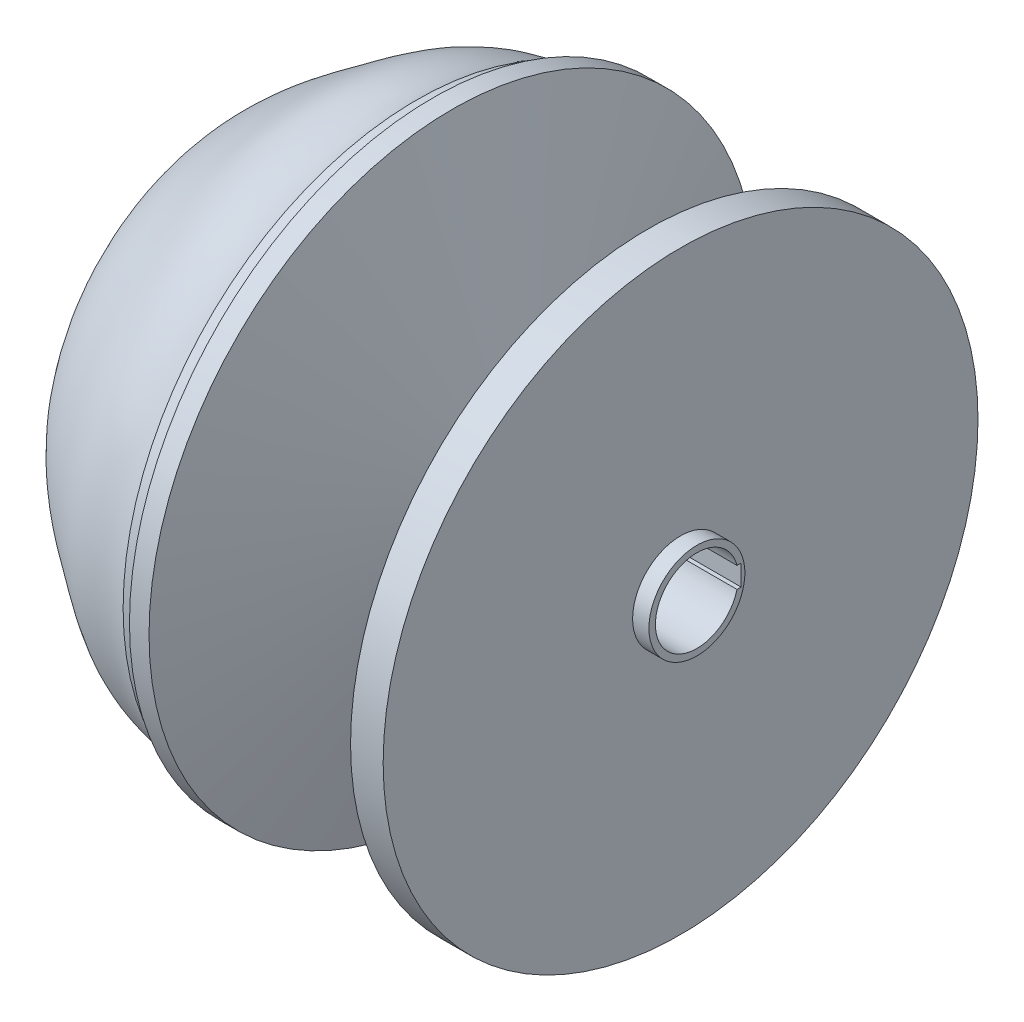
ISO-10303-21;
HEADER;
FILE_DESCRIPTION(('STEP AP214'),'2;1');
FILE_NAME('part.step','',(''),(''),'','','');
FILE_SCHEMA(('AUTOMOTIVE_DESIGN { 1 0 10303 214 1 1 1 1 }'));
ENDSEC;
DATA;
#1=APPLICATION_CONTEXT('core data for automotive mechanical design processes');
#2=APPLICATION_PROTOCOL_DEFINITION('international standard','automotive_design',2000,#1);
#3=PRODUCT_CONTEXT('',#1,'mechanical');
#4=PRODUCT('Part','Part','',(#3));
#5=PRODUCT_RELATED_PRODUCT_CATEGORY('part','',(#4));
#6=PRODUCT_DEFINITION_FORMATION('','',#4);
#7=PRODUCT_DEFINITION_CONTEXT('part definition',#1,'design');
#8=PRODUCT_DEFINITION('design','',#6,#7);
#9=PRODUCT_DEFINITION_SHAPE('','',#8);
#10=(LENGTH_UNIT() NAMED_UNIT(*) SI_UNIT(.MILLI.,.METRE.));
#11=(NAMED_UNIT(*) PLANE_ANGLE_UNIT() SI_UNIT($,.RADIAN.));
#12=(NAMED_UNIT(*) SI_UNIT($,.STERADIAN.) SOLID_ANGLE_UNIT());
#13=UNCERTAINTY_MEASURE_WITH_UNIT(LENGTH_MEASURE(1.E-05),#10,'distance_accuracy_value','');
#14=(GEOMETRIC_REPRESENTATION_CONTEXT(3) GLOBAL_UNCERTAINTY_ASSIGNED_CONTEXT((#13)) GLOBAL_UNIT_ASSIGNED_CONTEXT((#10,
#11,#12)) REPRESENTATION_CONTEXT('',''));
#15=CARTESIAN_POINT('',(0.,0.,0.));
#16=DIRECTION('',(0.,0.,1.));
#17=DIRECTION('',(1.,0.,0.));
#18=AXIS2_PLACEMENT_3D('',#15,#16,#17);
#19=CARTESIAN_POINT('',(79.335001792058,14.7092942906539,0.));
#20=DIRECTION('',(-1.,0.,0.));
#21=DIRECTION('',(0.,0.,1.));
#22=AXIS2_PLACEMENT_3D('',#19,#20,#21);
#23=PLANE('',#22);
#24=DIRECTION('',(0.,1.,0.));
#25=VECTOR('',#24,1.);
#26=CARTESIAN_POINT('',(79.335001792058,3.1875,-13.5635));
#27=LINE('',#26,#25);
#28=CARTESIAN_POINT('',(79.335001792058,-3.1875,-13.5635));
#29=VERTEX_POINT('',#28);
#30=CARTESIAN_POINT('',(79.335001792058,3.1875,-13.5635));
#31=VERTEX_POINT('',#30);
#32=EDGE_CURVE('E85',#29,#31,#27,.T.);
#33=ORIENTED_EDGE('',*,*,#32,.F.);
#34=DIRECTION('',(0.,0.,-1.));
#35=VECTOR('',#34,1.);
#36=CARTESIAN_POINT('',(79.335001792058,-3.1875,-11.8725));
#37=LINE('',#36,#35);
#38=CARTESIAN_POINT('',(79.335001792058,-3.1875,-12.3120821858043));
#39=VERTEX_POINT('',#38);
#40=EDGE_CURVE('E96',#39,#29,#37,.T.);
#41=ORIENTED_EDGE('',*,*,#40,.F.);
#42=CARTESIAN_POINT('',(79.335001792058,0.,0.));
#43=DIRECTION('',(1.,0.,0.));
#44=DIRECTION('',(0.,0.,-1.));
#45=AXIS2_PLACEMENT_3D('',#42,#43,#44);
#46=CIRCLE('',#45,12.718);
#47=CARTESIAN_POINT('',(79.335001792058,3.1875,-12.3120821858043));
#48=VERTEX_POINT('',#47);
#49=EDGE_CURVE('E108',#48,#39,#46,.T.);
#50=ORIENTED_EDGE('',*,*,#49,.F.);
#51=DIRECTION('',(0.,0.,1.));
#52=VECTOR('',#51,1.);
#53=CARTESIAN_POINT('',(79.335001792058,3.1875,-11.8725));
#54=LINE('',#53,#52);
#55=EDGE_CURVE('E98',#31,#48,#54,.T.);
#56=ORIENTED_EDGE('',*,*,#55,.F.);
#57=EDGE_LOOP('',(#33,#41,#50,#56));
#58=FACE_BOUND('',#57,.T.);
#59=CARTESIAN_POINT('',(79.335001792058,0.,0.));
#60=DIRECTION('',(-1.,0.,0.));
#61=DIRECTION('',(0.,0.,1.));
#62=AXIS2_PLACEMENT_3D('',#59,#60,#61);
#63=CIRCLE('',#62,14.7092942906539);
#64=CARTESIAN_POINT('',(79.335001792058,0.,14.7092942906539));
#65=VERTEX_POINT('',#64);
#66=EDGE_CURVE('E173',#65,#65,#63,.T.);
#67=ORIENTED_EDGE('',*,*,#66,.F.);
#68=EDGE_LOOP('',(#67));
#69=FACE_BOUND('',#68,.T.);
#70=ADVANCED_FACE('F39',(#58,#69),#23,.F.);
#71=CARTESIAN_POINT('',(-81.8356888062701,0.,0.));
#72=DIRECTION('',(-1.,0.,0.));
#73=DIRECTION('',(0.,0.,1.));
#74=AXIS2_PLACEMENT_3D('',#71,#72,#73);
#75=CYLINDRICAL_SURFACE('',#74,14.7092942906539);
#76=CARTESIAN_POINT('',(74.335001792058,0.,0.));
#77=DIRECTION('',(-1.,0.,0.));
#78=DIRECTION('',(0.,0.,1.));
#79=AXIS2_PLACEMENT_3D('',#76,#77,#78);
#80=CIRCLE('',#79,14.7092942906539);
#81=CARTESIAN_POINT('',(74.335001792058,0.,14.7092942906539));
#82=VERTEX_POINT('',#81);
#83=EDGE_CURVE('E176',#82,#82,#80,.T.);
#84=ORIENTED_EDGE('',*,*,#83,.F.);
#85=EDGE_LOOP('',(#84));
#86=FACE_BOUND('',#85,.T.);
#87=ORIENTED_EDGE('',*,*,#66,.T.);
#88=EDGE_LOOP('',(#87));
#89=FACE_BOUND('',#88,.T.);
#90=ADVANCED_FACE('F159',(#86,#89),#75,.T.);
#91=CARTESIAN_POINT('',(74.335001792058,91.2021540942188,0.));
#92=DIRECTION('',(-1.,0.,0.));
#93=DIRECTION('',(0.,0.,1.));
#94=AXIS2_PLACEMENT_3D('',#91,#92,#93);
#95=PLANE('',#94);
#96=CARTESIAN_POINT('',(74.3350017920579,0.,0.));
#97=DIRECTION('',(-1.,0.,0.));
#98=DIRECTION('',(0.,0.,1.));
#99=AXIS2_PLACEMENT_3D('',#96,#97,#98);
#100=CIRCLE('',#99,91.2021540942188);
#101=CARTESIAN_POINT('',(74.3350017920579,0.,91.2021540942188));
#102=VERTEX_POINT('',#101);
#103=EDGE_CURVE('E182',#102,#102,#100,.T.);
#104=ORIENTED_EDGE('',*,*,#103,.F.);
#105=EDGE_LOOP('',(#104));
#106=FACE_BOUND('',#105,.T.);
#107=ORIENTED_EDGE('',*,*,#83,.T.);
#108=EDGE_LOOP('',(#107));
#109=FACE_BOUND('',#108,.T.);
#110=ADVANCED_FACE('F155',(#106,#109),#95,.F.);
#111=CARTESIAN_POINT('',(-81.8356888062701,0.,0.));
#112=DIRECTION('',(-1.,0.,0.));
#113=DIRECTION('',(0.,0.,1.));
#114=AXIS2_PLACEMENT_3D('',#111,#112,#113);
#115=CYLINDRICAL_SURFACE('',#114,91.2021540942188);
#116=CARTESIAN_POINT('',(64.335001792058,0.,0.));
#117=DIRECTION('',(-1.,0.,0.));
#118=DIRECTION('',(0.,0.,1.));
#119=AXIS2_PLACEMENT_3D('',#116,#117,#118);
#120=CIRCLE('',#119,91.2021540942188);
#121=CARTESIAN_POINT('',(64.335001792058,0.,-91.2021540942188));
#122=VERTEX_POINT('',#121);
#123=EDGE_CURVE('E248',#122,#122,#120,.T.);
#124=ORIENTED_EDGE('',*,*,#123,.F.);
#125=EDGE_LOOP('',(#124));
#126=FACE_BOUND('',#125,.T.);
#127=ORIENTED_EDGE('',*,*,#103,.T.);
#128=EDGE_LOOP('',(#127));
#129=FACE_BOUND('',#128,.T.);
#130=ADVANCED_FACE('F151',(#126,#129),#115,.T.);
#131=CARTESIAN_POINT('',(64.335001792058,0.,0.));
#132=DIRECTION('',(1.,0.,0.));
#133=DIRECTION('',(0.,0.,-1.));
#134=AXIS2_PLACEMENT_3D('',#131,#132,#133);
#135=CONICAL_SURFACE('',#134,91.2021540942188,1.37003811702259);
#136=CARTESIAN_POINT('',(48.8278998094837,0.,0.));
#137=DIRECTION('',(-1.,0.,0.));
#138=DIRECTION('',(0.,0.,1.));
#139=AXIS2_PLACEMENT_3D('',#136,#137,#138);
#140=CIRCLE('',#139,15.);
#141=CARTESIAN_POINT('',(48.8278998094837,0.,-15.));
#142=VERTEX_POINT('',#141);
#143=EDGE_CURVE('E245',#142,#142,#140,.T.);
#144=CARTESIAN_POINT('',(48.8278998094837,0.,-15.));
#145=CARTESIAN_POINT('',(48.9894321218022,0.,-15.7937724384815));
#146=CARTESIAN_POINT('',(49.1509644341207,0.,-16.5875448769629));
#147=CARTESIAN_POINT('',(49.4740290587577,0.,-18.1750897539258));
#148=CARTESIAN_POINT('',(49.6355613710762,0.,-18.9688621924072));
#149=CARTESIAN_POINT('',(49.9586259957131,0.,-20.5564070693701));
#150=CARTESIAN_POINT('',(50.1201583080316,0.,-21.3501795078516));
#151=CARTESIAN_POINT('',(50.4432229326686,0.,-22.9377243848145));
#152=CARTESIAN_POINT('',(50.604755244987,0.,-23.7314968232959));
#153=CARTESIAN_POINT('',(50.927819869624,0.,-25.3190417002588));
#154=CARTESIAN_POINT('',(51.0893521819425,0.,-26.1128141387403));
#155=CARTESIAN_POINT('',(51.4124168065794,0.,-27.7003590157031));
#156=CARTESIAN_POINT('',(51.5739491188979,0.,-28.4941314541846));
#157=CARTESIAN_POINT('',(51.8970137435349,0.,-30.0816763311475));
#158=CARTESIAN_POINT('',(52.0585460558534,0.,-30.8754487696289));
#159=CARTESIAN_POINT('',(52.3816106804903,0.,-32.4629936465918));
#160=CARTESIAN_POINT('',(52.5431429928088,0.,-33.2567660850733));
#161=CARTESIAN_POINT('',(52.8662076174458,0.,-34.8443109620362));
#162=CARTESIAN_POINT('',(53.0277399297643,0.,-35.6380834005176));
#163=CARTESIAN_POINT('',(53.3508045544012,0.,-37.2256282774805));
#164=CARTESIAN_POINT('',(53.5123368667197,0.,-38.0194007159619));
#165=CARTESIAN_POINT('',(53.8354014913567,0.,-39.6069455929248));
#166=CARTESIAN_POINT('',(53.9969338036751,0.,-40.4007180314063));
#167=CARTESIAN_POINT('',(54.3199984283121,0.,-41.9882629083692));
#168=CARTESIAN_POINT('',(54.4815307406306,0.,-42.7820353468506));
#169=CARTESIAN_POINT('',(54.8045953652676,0.,-44.3695802238135));
#170=CARTESIAN_POINT('',(54.966127677586,0.,-45.163352662295));
#171=CARTESIAN_POINT('',(55.289192302223,0.,-46.7508975392578));
#172=CARTESIAN_POINT('',(55.4507246145415,0.,-47.5446699777393));
#173=CARTESIAN_POINT('',(55.7737892391784,0.,-49.1322148547022));
#174=CARTESIAN_POINT('',(55.9353215514969,0.,-49.9259872931836));
#175=CARTESIAN_POINT('',(56.2583861761339,0.,-51.5135321701465));
#176=CARTESIAN_POINT('',(56.4199184884524,0.,-52.307304608628));
#177=CARTESIAN_POINT('',(56.7429831130893,0.,-53.8948494855909));
#178=CARTESIAN_POINT('',(56.9045154254078,0.,-54.6886219240723));
#179=CARTESIAN_POINT('',(57.2275800500448,0.,-56.2761668010352));
#180=CARTESIAN_POINT('',(57.3891123623633,0.,-57.0699392395166));
#181=CARTESIAN_POINT('',(57.7121769870002,0.,-58.6574841164795));
#182=CARTESIAN_POINT('',(57.8737092993187,0.,-59.451256554961));
#183=CARTESIAN_POINT('',(58.1967739239557,0.,-61.0388014319239));
#184=CARTESIAN_POINT('',(58.3583062362741,0.,-61.8325738704053));
#185=CARTESIAN_POINT('',(58.6813708609111,0.,-63.4201187473682));
#186=CARTESIAN_POINT('',(58.8429031732296,0.,-64.2138911858496));
#187=CARTESIAN_POINT('',(59.1659677978665,0.,-65.8014360628125));
#188=CARTESIAN_POINT('',(59.327500110185,0.,-66.595208501294));
#189=CARTESIAN_POINT('',(59.650564734822,0.,-68.1827533782569));
#190=CARTESIAN_POINT('',(59.8120970471405,0.,-68.9765258167383));
#191=CARTESIAN_POINT('',(60.1351616717774,0.,-70.5640706937012));
#192=CARTESIAN_POINT('',(60.2966939840959,0.,-71.3578431321827));
#193=CARTESIAN_POINT('',(60.6197586087329,0.,-72.9453880091455));
#194=CARTESIAN_POINT('',(60.7812909210514,0.,-73.739160447627));
#195=CARTESIAN_POINT('',(61.1043555456883,0.,-75.3267053245899));
#196=CARTESIAN_POINT('',(61.2658878580068,0.,-76.1204777630713));
#197=CARTESIAN_POINT('',(61.5889524826438,0.,-77.7080226400342));
#198=CARTESIAN_POINT('',(61.7504847949623,0.,-78.5017950785157));
#199=CARTESIAN_POINT('',(62.0735494195992,0.,-80.0893399554786));
#200=CARTESIAN_POINT('',(62.2350817319177,0.,-80.88311239396));
#201=CARTESIAN_POINT('',(62.5581463565547,0.,-82.4706572709229));
#202=CARTESIAN_POINT('',(62.7196786688731,0.,-83.2644297094043));
#203=CARTESIAN_POINT('',(63.0427432935101,0.,-84.8519745863672));
#204=CARTESIAN_POINT('',(63.2042756058286,0.,-85.6457470248487));
#205=CARTESIAN_POINT('',(63.5273402304655,0.,-87.2332919018116));
#206=CARTESIAN_POINT('',(63.688872542784,0.,-88.027064340293));
#207=CARTESIAN_POINT('',(64.011937167421,0.,-89.6146092172559));
#208=CARTESIAN_POINT('',(64.1734694797395,0.,-90.4083816557373));
#209=CARTESIAN_POINT('',(64.335001792058,0.,-91.2021540942188));
#210=B_SPLINE_CURVE_WITH_KNOTS('',3,(#144,#145,#146,#147,#148,#149,#150,#151,#152,#153,#154,
#155,#156,#157,#158,#159,#160,#161,#162,#163,#164,#165,#166,#167,#168,#169,#170,#171,#172,#173,
#174,#175,#176,#177,#178,#179,#180,#181,#182,#183,#184,#185,#186,#187,#188,#189,#190,#191,#192,
#193,#194,#195,#196,#197,#198,#199,#200,#201,#202,#203,#204,#205,#206,#207,#208,#209),
.UNSPECIFIED.,.F.,.F.,(4,2,2,2,2,2,2,2,2,2,2,2,2,2,2,2,2,2,2,2,2,2,2,2,2,2,2,2,2,2,2,2,4),(0.,
2.43012475978944,4.86024951957886,7.29037427936828,9.72049903915771,12.1506237989471,
14.5807485587366,17.010873318526,19.4409980783154,21.8711228381048,24.3012475978943,
26.7313723576837,29.1614971174731,31.5916218772626,34.021746637052,36.4518713968414,
38.8819961566308,41.3121209164203,43.7422456762097,46.1723704359991,48.6024951957886,
51.032619955578,53.4627447153674,55.8928694751568,58.3229942349463,60.7531189947357,
63.1832437545251,65.6133685143146,68.043493274104,70.4736180338934,72.9037427936828,
75.3338675534722,77.7639923132617),.UNSPECIFIED.);
#211=EDGE_CURVE('BSEAM147',#142,#122,#210,.T.);
#212=ORIENTED_EDGE('',*,*,#143,.F.);
#213=ORIENTED_EDGE('',*,*,#123,.T.);
#214=ORIENTED_EDGE('',*,*,#211,.T.);
#215=ORIENTED_EDGE('',*,*,#211,.F.);
#216=EDGE_LOOP('',(#212,#214,#213,#215));
#217=FACE_BOUND('',#216,.T.);
#218=ADVANCED_FACE('F147',(#217),#135,.T.);
#219=CARTESIAN_POINT('',(-81.8356888062701,0.,0.));
#220=DIRECTION('',(-1.,0.,0.));
#221=DIRECTION('',(0.,0.,1.));
#222=AXIS2_PLACEMENT_3D('',#219,#220,#221);
#223=CYLINDRICAL_SURFACE('',#222,15.);
#224=CARTESIAN_POINT('',(23.8278998094837,0.,0.));
#225=DIRECTION('',(-1.,0.,0.));
#226=DIRECTION('',(0.,0.,1.));
#227=AXIS2_PLACEMENT_3D('',#224,#225,#226);
#228=CIRCLE('',#227,15.);
#229=CARTESIAN_POINT('',(23.8278998094837,0.,15.));
#230=VERTEX_POINT('',#229);
#231=EDGE_CURVE('E242',#230,#230,#228,.T.);
#232=ORIENTED_EDGE('',*,*,#231,.F.);
#233=EDGE_LOOP('',(#232));
#234=FACE_BOUND('',#233,.T.);
#235=ORIENTED_EDGE('',*,*,#143,.T.);
#236=EDGE_LOOP('',(#235));
#237=FACE_BOUND('',#236,.T.);
#238=ADVANCED_FACE('F143',(#234,#237),#223,.T.);
#239=CARTESIAN_POINT('',(23.8278998094837,0.,0.));
#240=DIRECTION('',(-1.,0.,0.));
#241=DIRECTION('',(0.,0.,1.));
#242=AXIS2_PLACEMENT_3D('',#239,#240,#241);
#243=CONICAL_SURFACE('',#242,15.,1.32590336061779);
#244=CARTESIAN_POINT('',(4.33500179205795,0.,0.));
#245=DIRECTION('',(-1.,0.,0.));
#246=DIRECTION('',(0.,0.,1.));
#247=AXIS2_PLACEMENT_3D('',#244,#245,#246);
#248=CIRCLE('',#247,93.);
#249=CARTESIAN_POINT('',(4.33500179205795,0.,93.));
#250=VERTEX_POINT('',#249);
#251=EDGE_CURVE('E239',#250,#250,#248,.T.);
#252=CARTESIAN_POINT('',(4.33500179205795,0.,93.));
#253=CARTESIAN_POINT('',(4.53805281307281,0.,92.1875));
#254=CARTESIAN_POINT('',(4.74110383408766,0.,91.375));
#255=CARTESIAN_POINT('',(5.14720587611736,0.,89.75));
#256=CARTESIAN_POINT('',(5.35025689713221,0.,88.9375));
#257=CARTESIAN_POINT('',(5.75635893916192,0.,87.3125));
#258=CARTESIAN_POINT('',(5.95940996017677,0.,86.5));
#259=CARTESIAN_POINT('',(6.36551200220647,0.,84.875));
#260=CARTESIAN_POINT('',(6.56856302322132,0.,84.0625));
#261=CARTESIAN_POINT('',(6.97466506525103,0.,82.4375));
#262=CARTESIAN_POINT('',(7.17771608626588,0.,81.625));
#263=CARTESIAN_POINT('',(7.58381812829558,0.,80.));
#264=CARTESIAN_POINT('',(7.78686914931044,0.,79.1875));
#265=CARTESIAN_POINT('',(8.19297119134014,0.,77.5625));
#266=CARTESIAN_POINT('',(8.39602221235499,0.,76.75));
#267=CARTESIAN_POINT('',(8.8021242543847,0.,75.125));
#268=CARTESIAN_POINT('',(9.00517527539955,0.,74.3125));
#269=CARTESIAN_POINT('',(9.41127731742925,0.,72.6875));
#270=CARTESIAN_POINT('',(9.61432833844411,0.,71.875));
#271=CARTESIAN_POINT('',(10.0204303804738,0.,70.25));
#272=CARTESIAN_POINT('',(10.2234814014887,0.,69.4375));
#273=CARTESIAN_POINT('',(10.6295834435184,0.,67.8125));
#274=CARTESIAN_POINT('',(10.8326344645332,0.,67.));
#275=CARTESIAN_POINT('',(11.2387365065629,0.,65.375));
#276=CARTESIAN_POINT('',(11.4417875275778,0.,64.5625));
#277=CARTESIAN_POINT('',(11.8478895696075,0.,62.9375));
#278=CARTESIAN_POINT('',(12.0509405906223,0.,62.125));
#279=CARTESIAN_POINT('',(12.457042632652,0.,60.5));
#280=CARTESIAN_POINT('',(12.6600936536669,0.,59.6875));
#281=CARTESIAN_POINT('',(13.0661956956966,0.,58.0625));
#282=CARTESIAN_POINT('',(13.2692467167114,0.,57.25));
#283=CARTESIAN_POINT('',(13.6753487587411,0.,55.625));
#284=CARTESIAN_POINT('',(13.878399779756,0.,54.8125));
#285=CARTESIAN_POINT('',(14.2845018217857,0.,53.1875));
#286=CARTESIAN_POINT('',(14.4875528428006,0.,52.375));
#287=CARTESIAN_POINT('',(14.8936548848303,0.,50.75));
#288=CARTESIAN_POINT('',(15.0967059058451,0.,49.9375));
#289=CARTESIAN_POINT('',(15.5028079478748,0.,48.3125));
#290=CARTESIAN_POINT('',(15.7058589688897,0.,47.5));
#291=CARTESIAN_POINT('',(16.1119610109194,0.,45.875));
#292=CARTESIAN_POINT('',(16.3150120319342,0.,45.0625));
#293=CARTESIAN_POINT('',(16.7211140739639,0.,43.4375));
#294=CARTESIAN_POINT('',(16.9241650949788,0.,42.625));
#295=CARTESIAN_POINT('',(17.3302671370085,0.,41.));
#296=CARTESIAN_POINT('',(17.5333181580233,0.,40.1875));
#297=CARTESIAN_POINT('',(17.939420200053,0.,38.5625));
#298=CARTESIAN_POINT('',(18.1424712210679,0.,37.75));
#299=CARTESIAN_POINT('',(18.5485732630976,0.,36.125));
#300=CARTESIAN_POINT('',(18.7516242841124,0.,35.3125));
#301=CARTESIAN_POINT('',(19.1577263261421,0.,33.6875));
#302=CARTESIAN_POINT('',(19.360777347157,0.,32.875));
#303=CARTESIAN_POINT('',(19.7668793891867,0.,31.25));
#304=CARTESIAN_POINT('',(19.9699304102016,0.,30.4375));
#305=CARTESIAN_POINT('',(20.3760324522313,0.,28.8125));
#306=CARTESIAN_POINT('',(20.5790834732461,0.,28.));
#307=CARTESIAN_POINT('',(20.9851855152758,0.,26.375));
#308=CARTESIAN_POINT('',(21.1882365362907,0.,25.5625));
#309=CARTESIAN_POINT('',(21.5943385783204,0.,23.9375));
#310=CARTESIAN_POINT('',(21.7973895993352,0.,23.125));
#311=CARTESIAN_POINT('',(22.2034916413649,0.,21.5));
#312=CARTESIAN_POINT('',(22.4065426623798,0.,20.6875));
#313=CARTESIAN_POINT('',(22.8126447044095,0.,19.0625));
#314=CARTESIAN_POINT('',(23.0156957254243,0.,18.25));
#315=CARTESIAN_POINT('',(23.421797767454,0.,16.625));
#316=CARTESIAN_POINT('',(23.6248487884689,0.,15.8125));
#317=CARTESIAN_POINT('',(23.8278998094837,0.,15.));
#318=B_SPLINE_CURVE_WITH_KNOTS('',3,(#252,#253,#254,#255,#256,#257,#258,#259,#260,#261,#262,
#263,#264,#265,#266,#267,#268,#269,#270,#271,#272,#273,#274,#275,#276,#277,#278,#279,#280,#281,
#282,#283,#284,#285,#286,#287,#288,#289,#290,#291,#292,#293,#294,#295,#296,#297,#298,#299,#300,
#301,#302,#303,#304,#305,#306,#307,#308,#309,#310,#311,#312,#313,#314,#315,#316,#317),
.UNSPECIFIED.,.F.,.F.,(4,2,2,2,2,2,2,2,2,2,2,2,2,2,2,2,2,2,2,2,2,2,2,2,2,2,2,2,2,2,2,2,4),(0.,
2.51246367221828,5.02492734443656,7.53739101665483,10.0498546888731,12.5623183610914,
15.0747820333097,17.587245705528,20.0997093777462,22.6121730499645,25.1246367221828,
27.6371003944011,30.1495640666194,32.6620277388376,35.1744914110559,37.6869550832742,
40.1994187554925,42.7118824277107,45.224346099929,47.7368097721473,50.2492734443656,
52.7617371165839,55.2742007888021,57.7866644610204,60.2991281332387,62.811591805457,
65.3240554776753,67.8365191498935,70.3489828221118,72.8614464943301,75.3739101665484,
77.8863738387667,80.398837510985),.UNSPECIFIED.);
#319=EDGE_CURVE('BSEAM139',#250,#230,#318,.T.);
#320=ORIENTED_EDGE('',*,*,#251,.F.);
#321=ORIENTED_EDGE('',*,*,#231,.T.);
#322=ORIENTED_EDGE('',*,*,#319,.T.);
#323=ORIENTED_EDGE('',*,*,#319,.F.);
#324=EDGE_LOOP('',(#320,#322,#321,#323));
#325=FACE_BOUND('',#324,.T.);
#326=ADVANCED_FACE('F139',(#325),#243,.T.);
#327=CARTESIAN_POINT('',(-81.8356888062701,0.,0.));
#328=DIRECTION('',(-1.,0.,0.));
#329=DIRECTION('',(0.,0.,1.));
#330=AXIS2_PLACEMENT_3D('',#327,#328,#329);
#331=CYLINDRICAL_SURFACE('',#330,93.);
#332=CARTESIAN_POINT('',(-1.66499820794205,0.,0.));
#333=DIRECTION('',(-1.,0.,0.));
#334=DIRECTION('',(0.,0.,1.));
#335=AXIS2_PLACEMENT_3D('',#332,#333,#334);
#336=CIRCLE('',#335,93.);
#337=CARTESIAN_POINT('',(-1.66499820794205,0.,93.));
#338=VERTEX_POINT('',#337);
#339=EDGE_CURVE('E236',#338,#338,#336,.T.);
#340=ORIENTED_EDGE('',*,*,#339,.F.);
#341=EDGE_LOOP('',(#340));
#342=FACE_BOUND('',#341,.T.);
#343=ORIENTED_EDGE('',*,*,#251,.T.);
#344=EDGE_LOOP('',(#343));
#345=FACE_BOUND('',#344,.T.);
#346=ADVANCED_FACE('F135',(#342,#345),#331,.T.);
#347=CARTESIAN_POINT('',(-1.66499820794205,90.,0.));
#348=DIRECTION('',(1.,0.,0.));
#349=DIRECTION('',(0.,0.,-1.));
#350=AXIS2_PLACEMENT_3D('',#347,#348,#349);
#351=PLANE('',#350);
#352=CARTESIAN_POINT('',(-1.66499820794205,0.,0.));
#353=DIRECTION('',(-1.,0.,0.));
#354=DIRECTION('',(0.,0.,1.));
#355=AXIS2_PLACEMENT_3D('',#352,#353,#354);
#356=CIRCLE('',#355,90.);
#357=CARTESIAN_POINT('',(-1.66499820794205,0.,90.));
#358=VERTEX_POINT('',#357);
#359=EDGE_CURVE('E233',#358,#358,#356,.T.);
#360=ORIENTED_EDGE('',*,*,#359,.F.);
#361=EDGE_LOOP('',(#360));
#362=FACE_BOUND('',#361,.T.);
#363=ORIENTED_EDGE('',*,*,#339,.T.);
#364=EDGE_LOOP('',(#363));
#365=FACE_BOUND('',#364,.T.);
#366=ADVANCED_FACE('F131',(#362,#365),#351,.F.);
#367=CARTESIAN_POINT('',(-81.8356888062701,0.,0.));
#368=DIRECTION('',(-1.,0.,0.));
#369=DIRECTION('',(0.,0.,1.));
#370=AXIS2_PLACEMENT_3D('',#367,#368,#369);
#371=CYLINDRICAL_SURFACE('',#370,90.);
#372=CARTESIAN_POINT('',(-6.60762880701433,0.,0.));
#373=DIRECTION('',(-1.,0.,0.));
#374=DIRECTION('',(0.,0.,1.));
#375=AXIS2_PLACEMENT_3D('',#372,#373,#374);
#376=CIRCLE('',#375,90.);
#377=CARTESIAN_POINT('',(-6.60762880701433,0.,90.));
#378=VERTEX_POINT('',#377);
#379=EDGE_CURVE('E228',#378,#378,#376,.T.);
#380=ORIENTED_EDGE('',*,*,#379,.F.);
#381=EDGE_LOOP('',(#380));
#382=FACE_BOUND('',#381,.T.);
#383=ORIENTED_EDGE('',*,*,#359,.T.);
#384=EDGE_LOOP('',(#383));
#385=FACE_BOUND('',#384,.T.);
#386=ADVANCED_FACE('F126',(#382,#385),#371,.T.);
#387=CARTESIAN_POINT('',(-6.60762880701433,90.,0.));
#388=CARTESIAN_POINT('',(-12.1521266618955,86.8994461644345,0.));
#389=CARTESIAN_POINT('',(-26.2583447826103,86.8313114927232,0.));
#390=CARTESIAN_POINT('',(-38.6365827784882,76.8933571705503,0.));
#391=CARTESIAN_POINT('',(-58.6811970477299,63.1702925765508,0.));
#392=CARTESIAN_POINT('',(-72.2965321462091,50.1852355423744,0.));
#393=CARTESIAN_POINT('',(-70.911998207942,32.718,0.));
#394=B_SPLINE_CURVE_WITH_KNOTS('',3,(#387,#388,#389,#390,#391,#392,#393),.UNSPECIFIED.,.F.,.F.,
(4,1,1,1,4),(0.,0.203397129950727,0.436695531479509,0.495766926252523,1.),.UNSPECIFIED.);
#395=CARTESIAN_POINT('',(-81.8356888062701,0.,0.));
#396=DIRECTION('',(-1.,0.,0.));
#397=AXIS1_PLACEMENT('',#395,#396);
#398=SURFACE_OF_REVOLUTION('',#394,#397);
#399=CARTESIAN_POINT('',(-70.911998207942,0.,0.));
#400=DIRECTION('',(-1.,0.,0.));
#401=DIRECTION('',(0.,0.,1.));
#402=AXIS2_PLACEMENT_3D('',#399,#400,#401);
#403=CIRCLE('',#402,32.718);
#404=CARTESIAN_POINT('',(-70.911998207942,0.,32.718));
#405=VERTEX_POINT('',#404);
#406=EDGE_CURVE('E226',#405,#405,#403,.T.);
#407=ORIENTED_EDGE('',*,*,#406,.F.);
#408=EDGE_LOOP('',(#407));
#409=FACE_BOUND('',#408,.T.);
#410=ORIENTED_EDGE('',*,*,#379,.T.);
#411=EDGE_LOOP('',(#410));
#412=FACE_BOUND('',#411,.T.);
#413=ADVANCED_FACE('F121',(#409,#412),#398,.T.);
#414=CARTESIAN_POINT('',(-70.911998207942,12.718,0.));
#415=DIRECTION('',(1.,0.,0.));
#416=DIRECTION('',(0.,0.,-1.));
#417=AXIS2_PLACEMENT_3D('',#414,#415,#416);
#418=PLANE('',#417);
#419=CARTESIAN_POINT('',(-70.911998207942,0.,0.));
#420=DIRECTION('',(-1.,0.,0.));
#421=DIRECTION('',(0.,0.,1.));
#422=AXIS2_PLACEMENT_3D('',#419,#420,#421);
#423=CIRCLE('',#422,12.718);
#424=CARTESIAN_POINT('',(-70.911998207942,0.,12.718));
#425=VERTEX_POINT('',#424);
#426=EDGE_CURVE('E225',#425,#425,#423,.T.);
#427=ORIENTED_EDGE('',*,*,#426,.F.);
#428=EDGE_LOOP('',(#427));
#429=FACE_BOUND('',#428,.T.);
#430=ORIENTED_EDGE('',*,*,#406,.T.);
#431=EDGE_LOOP('',(#430));
#432=FACE_BOUND('',#431,.T.);
#433=ADVANCED_FACE('F125',(#429,#432),#418,.F.);
#434=CARTESIAN_POINT('',(-81.8356888062701,0.,0.));
#435=DIRECTION('',(-1.,0.,0.));
#436=DIRECTION('',(0.,0.,1.));
#437=AXIS2_PLACEMENT_3D('',#434,#435,#436);
#438=CYLINDRICAL_SURFACE('',#437,12.718);
#439=CARTESIAN_POINT('',(-80.911998207942,0.,0.));
#440=DIRECTION('',(-1.,0.,0.));
#441=DIRECTION('',(0.,0.,1.));
#442=AXIS2_PLACEMENT_3D('',#439,#440,#441);
#443=CIRCLE('',#442,12.718);
#444=CARTESIAN_POINT('',(-80.911998207942,0.,12.718));
#445=VERTEX_POINT('',#444);
#446=EDGE_CURVE('E111',#445,#445,#443,.T.);
#447=ORIENTED_EDGE('',*,*,#446,.F.);
#448=EDGE_LOOP('',(#447));
#449=FACE_BOUND('',#448,.T.);
#450=ORIENTED_EDGE('',*,*,#426,.T.);
#451=EDGE_LOOP('',(#450));
#452=FACE_BOUND('',#451,.T.);
#453=ADVANCED_FACE('F212',(#449,#452),#438,.T.);
#454=CARTESIAN_POINT('',(-80.911998207942,0.,0.));
#455=DIRECTION('',(1.,0.,0.));
#456=DIRECTION('',(0.,0.,-1.));
#457=AXIS2_PLACEMENT_3D('',#454,#455,#456);
#458=PLANE('',#457);
#459=CARTESIAN_POINT('',(-80.911998207942,0.,0.));
#460=DIRECTION('',(-1.,0.,0.));
#461=DIRECTION('',(0.,0.,1.));
#462=AXIS2_PLACEMENT_3D('',#459,#460,#461);
#463=CIRCLE('',#462,10.);
#464=CARTESIAN_POINT('',(-80.911998207942,0.,10.));
#465=VERTEX_POINT('',#464);
#466=EDGE_CURVE('E104',#465,#465,#463,.T.);
#467=ORIENTED_EDGE('',*,*,#466,.F.);
#468=EDGE_LOOP('',(#467));
#469=FACE_BOUND('',#468,.T.);
#470=ORIENTED_EDGE('',*,*,#446,.T.);
#471=EDGE_LOOP('',(#470));
#472=FACE_BOUND('',#471,.T.);
#473=ADVANCED_FACE('F210',(#469,#472),#458,.F.);
#474=CARTESIAN_POINT('',(-3.40499820794203,0.,0.));
#475=DIRECTION('',(1.,0.,0.));
#476=DIRECTION('',(0.,0.,-1.));
#477=AXIS2_PLACEMENT_3D('',#474,#475,#476);
#478=CYLINDRICAL_SURFACE('',#477,12.718);
#479=ORIENTED_EDGE('',*,*,#49,.T.);
#480=DIRECTION('',(1.,0.,0.));
#481=VECTOR('',#480,1.);
#482=CARTESIAN_POINT('',(-3.40499820794203,-3.1875,-12.3120821858043));
#483=LINE('',#482,#481);
#484=CARTESIAN_POINT('',(23.335001792058,-3.1875,-12.3120821858043));
#485=VERTEX_POINT('',#484);
#486=EDGE_CURVE('E11',#39,#485,#483,.F.);
#487=ORIENTED_EDGE('',*,*,#486,.T.);
#488=CARTESIAN_POINT('',(23.335001792058,0.,0.));
#489=DIRECTION('',(1.,0.,0.));
#490=DIRECTION('',(0.,0.,-1.));
#491=AXIS2_PLACEMENT_3D('',#488,#489,#490);
#492=CIRCLE('',#491,12.718);
#493=CARTESIAN_POINT('',(23.335001792058,3.1875,-12.3120821858043));
#494=VERTEX_POINT('',#493);
#495=EDGE_CURVE('E59',#494,#485,#492,.F.);
#496=ORIENTED_EDGE('',*,*,#495,.F.);
#497=DIRECTION('',(1.,0.,0.));
#498=VECTOR('',#497,1.);
#499=CARTESIAN_POINT('',(-3.40499820794203,3.1875,-12.3120821858043));
#500=LINE('',#499,#498);
#501=EDGE_CURVE('E47',#494,#48,#500,.T.);
#502=ORIENTED_EDGE('',*,*,#501,.T.);
#503=EDGE_LOOP('',(#479,#487,#496,#502));
#504=FACE_BOUND('',#503,.T.);
#505=CARTESIAN_POINT('',(-3.56781098385351,0.,0.));
#506=DIRECTION('',(1.,0.,0.));
#507=DIRECTION('',(0.,0.,-1.));
#508=AXIS2_PLACEMENT_3D('',#505,#506,#507);
#509=CIRCLE('',#508,12.718);
#510=CARTESIAN_POINT('',(-3.56781098385351,0.,-12.718));
#511=VERTEX_POINT('',#510);
#512=EDGE_CURVE('E179',#511,#511,#509,.F.);
#513=ORIENTED_EDGE('',*,*,#512,.T.);
#514=EDGE_LOOP('',(#513));
#515=FACE_BOUND('',#514,.T.);
#516=ADVANCED_FACE('F190',(#504,#515),#478,.F.);
#517=CARTESIAN_POINT('',(-1.40499820794202,0.,0.));
#518=DIRECTION('',(-1.,0.,0.));
#519=DIRECTION('',(0.,0.,1.));
#520=AXIS2_PLACEMENT_3D('',#517,#518,#519);
#521=CYLINDRICAL_SURFACE('',#520,10.);
#522=CARTESIAN_POINT('',(-5.13704901551094,0.,0.));
#523=DIRECTION('',(1.,0.,0.));
#524=DIRECTION('',(0.,0.,-1.));
#525=AXIS2_PLACEMENT_3D('',#522,#523,#524);
#526=CIRCLE('',#525,10.);
#527=CARTESIAN_POINT('',(-5.13704901551094,0.,-10.));
#528=VERTEX_POINT('',#527);
#529=EDGE_CURVE('E175',#528,#528,#526,.T.);
#530=ORIENTED_EDGE('',*,*,#529,.T.);
#531=EDGE_LOOP('',(#530));
#532=FACE_BOUND('',#531,.T.);
#533=ORIENTED_EDGE('',*,*,#466,.T.);
#534=EDGE_LOOP('',(#533));
#535=FACE_BOUND('',#534,.T.);
#536=ADVANCED_FACE('F200',(#532,#535),#521,.F.);
#537=CARTESIAN_POINT('',(-5.13704901551094,0.,0.));
#538=DIRECTION('',(1.,0.,0.));
#539=DIRECTION('',(0.,0.,-1.));
#540=AXIS2_PLACEMENT_3D('',#537,#538,#539);
#541=CONICAL_SURFACE('',#540,10.,1.04719755119659);
#542=ORIENTED_EDGE('',*,*,#512,.F.);
#543=EDGE_LOOP('',(#542));
#544=FACE_BOUND('',#543,.T.);
#545=ORIENTED_EDGE('',*,*,#529,.F.);
#546=EDGE_LOOP('',(#545));
#547=FACE_BOUND('',#546,.T.);
#548=ADVANCED_FACE('F41',(#544,#547),#541,.F.);
#549=CARTESIAN_POINT('',(23.335001792058,-3.1875,-11.8725));
#550=DIRECTION('',(0.,-1.,0.));
#551=DIRECTION('',(0.,0.,-1.));
#552=AXIS2_PLACEMENT_3D('',#549,#550,#551);
#553=PLANE('',#552);
#554=ORIENTED_EDGE('',*,*,#40,.T.);
#555=DIRECTION('',(1.,0.,0.));
#556=VECTOR('',#555,1.);
#557=CARTESIAN_POINT('',(23.335001792058,-3.1875,-13.5635));
#558=LINE('',#557,#556);
#559=CARTESIAN_POINT('',(23.335001792058,-3.1875,-13.5635));
#560=VERTEX_POINT('',#559);
#561=EDGE_CURVE('E88',#560,#29,#558,.T.);
#562=ORIENTED_EDGE('',*,*,#561,.F.);
#563=DIRECTION('',(0.,0.,-1.));
#564=VECTOR('',#563,1.);
#565=CARTESIAN_POINT('',(23.335001792058,-3.1875,-11.8725));
#566=LINE('',#565,#564);
#567=EDGE_CURVE('E89',#485,#560,#566,.T.);
#568=ORIENTED_EDGE('',*,*,#567,.F.);
#569=ORIENTED_EDGE('',*,*,#486,.F.);
#570=EDGE_LOOP('',(#554,#562,#568,#569));
#571=FACE_BOUND('',#570,.T.);
#572=ADVANCED_FACE('F193',(#571),#553,.F.);
#573=CARTESIAN_POINT('',(23.335001792058,3.1875,-11.8725));
#574=DIRECTION('',(0.,1.,0.));
#575=DIRECTION('',(0.,0.,1.));
#576=AXIS2_PLACEMENT_3D('',#573,#574,#575);
#577=PLANE('',#576);
#578=DIRECTION('',(0.,0.,1.));
#579=VECTOR('',#578,1.);
#580=CARTESIAN_POINT('',(23.335001792058,3.1875,-11.8725));
#581=LINE('',#580,#579);
#582=CARTESIAN_POINT('',(23.335001792058,3.1875,-13.5635));
#583=VERTEX_POINT('',#582);
#584=EDGE_CURVE('E54',#583,#494,#581,.T.);
#585=ORIENTED_EDGE('',*,*,#584,.F.);
#586=DIRECTION('',(1.,0.,0.));
#587=VECTOR('',#586,1.);
#588=CARTESIAN_POINT('',(23.335001792058,3.1875,-13.5635));
#589=LINE('',#588,#587);
#590=EDGE_CURVE('E80',#583,#31,#589,.T.);
#591=ORIENTED_EDGE('',*,*,#590,.T.);
#592=ORIENTED_EDGE('',*,*,#55,.T.);
#593=ORIENTED_EDGE('',*,*,#501,.F.);
#594=EDGE_LOOP('',(#585,#591,#592,#593));
#595=FACE_BOUND('',#594,.T.);
#596=ADVANCED_FACE('F91',(#595),#577,.F.);
#597=CARTESIAN_POINT('',(23.335001792058,0.,0.));
#598=DIRECTION('',(1.,0.,0.));
#599=DIRECTION('',(0.,0.,-1.));
#600=AXIS2_PLACEMENT_3D('',#597,#598,#599);
#601=PLANE('',#600);
#602=ORIENTED_EDGE('',*,*,#495,.T.);
#603=ORIENTED_EDGE('',*,*,#567,.T.);
#604=DIRECTION('',(0.,1.,0.));
#605=VECTOR('',#604,1.);
#606=CARTESIAN_POINT('',(23.335001792058,3.1875,-13.5635));
#607=LINE('',#606,#605);
#608=EDGE_CURVE('E83',#560,#583,#607,.T.);
#609=ORIENTED_EDGE('',*,*,#608,.T.);
#610=ORIENTED_EDGE('',*,*,#584,.T.);
#611=EDGE_LOOP('',(#602,#603,#609,#610));
#612=FACE_BOUND('',#611,.T.);
#613=ADVANCED_FACE('F94',(#612),#601,.T.);
#614=CARTESIAN_POINT('',(23.335001792058,3.1875,-13.5635));
#615=DIRECTION('',(0.,0.,-1.));
#616=DIRECTION('',(0.,1.,0.));
#617=AXIS2_PLACEMENT_3D('',#614,#615,#616);
#618=PLANE('',#617);
#619=ORIENTED_EDGE('',*,*,#32,.T.);
#620=ORIENTED_EDGE('',*,*,#590,.F.);
#621=ORIENTED_EDGE('',*,*,#608,.F.);
#622=ORIENTED_EDGE('',*,*,#561,.T.);
#623=EDGE_LOOP('',(#619,#620,#621,#622));
#624=FACE_BOUND('',#623,.T.);
#625=ADVANCED_FACE('F81',(#624),#618,.F.);
#626=CLOSED_SHELL('',(#70,#90,#110,#130,#218,#238,#326,#346,#366,#386,#413,#433,#453,#473,#516,
#536,#548,#572,#596,#613,#625));
#627=MANIFOLD_SOLID_BREP('B2',#626);
#628=ADVANCED_BREP_SHAPE_REPRESENTATION('',(#18,#627),#14);
#629=SHAPE_DEFINITION_REPRESENTATION(#9,#628);
ENDSEC;
END-ISO-10303-21;
